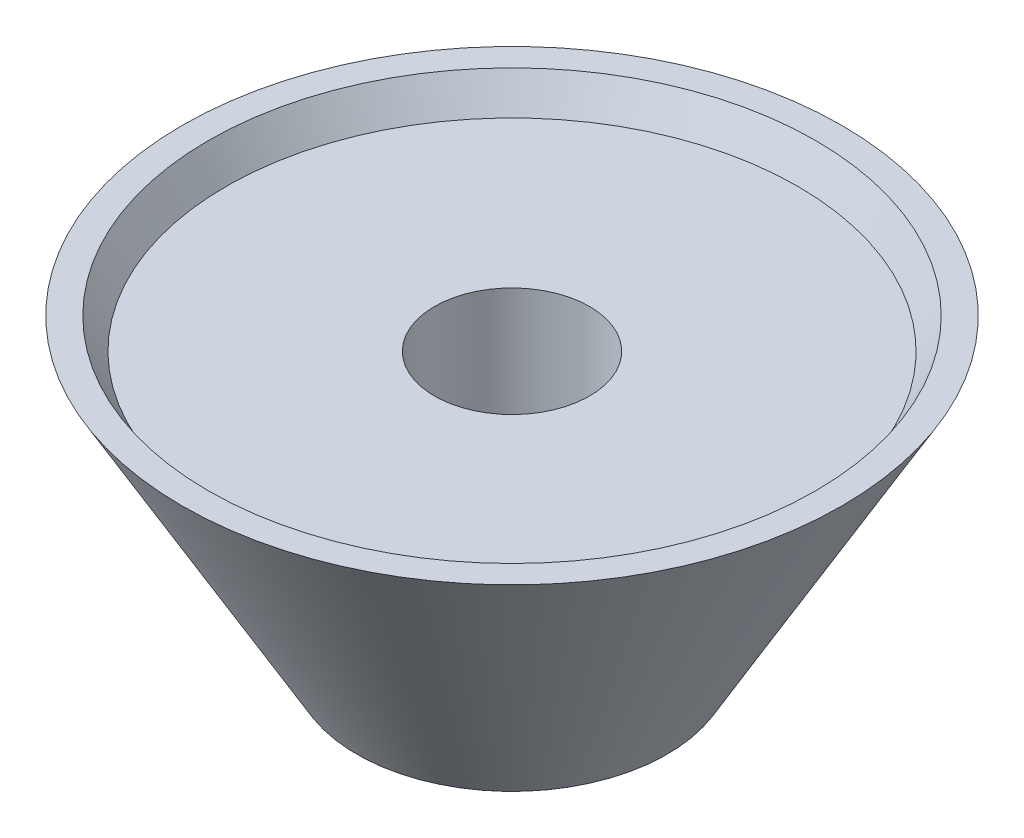
ISO-10303-21;
HEADER;
FILE_DESCRIPTION(('STEP AP214'),'2;1');
FILE_NAME('part.step','',(''),(''),'','','');
FILE_SCHEMA(('AUTOMOTIVE_DESIGN { 1 0 10303 214 1 1 1 1 }'));
ENDSEC;
DATA;
#1=APPLICATION_CONTEXT('core data for automotive mechanical design processes');
#2=APPLICATION_PROTOCOL_DEFINITION('international standard','automotive_design',2000,#1);
#3=PRODUCT_CONTEXT('',#1,'mechanical');
#4=PRODUCT('Part','Part','',(#3));
#5=PRODUCT_RELATED_PRODUCT_CATEGORY('part','',(#4));
#6=PRODUCT_DEFINITION_FORMATION('','',#4);
#7=PRODUCT_DEFINITION_CONTEXT('part definition',#1,'design');
#8=PRODUCT_DEFINITION('design','',#6,#7);
#9=PRODUCT_DEFINITION_SHAPE('','',#8);
#10=(LENGTH_UNIT() NAMED_UNIT(*) SI_UNIT(.MILLI.,.METRE.));
#11=(NAMED_UNIT(*) PLANE_ANGLE_UNIT() SI_UNIT($,.RADIAN.));
#12=(NAMED_UNIT(*) SI_UNIT($,.STERADIAN.) SOLID_ANGLE_UNIT());
#13=UNCERTAINTY_MEASURE_WITH_UNIT(LENGTH_MEASURE(1.E-05),#10,'distance_accuracy_value','');
#14=(GEOMETRIC_REPRESENTATION_CONTEXT(3) GLOBAL_UNCERTAINTY_ASSIGNED_CONTEXT((#13)) GLOBAL_UNIT_ASSIGNED_CONTEXT((#10,
#11,#12)) REPRESENTATION_CONTEXT('',''));
#15=CARTESIAN_POINT('',(0.,0.,0.));
#16=DIRECTION('',(0.,0.,1.));
#17=DIRECTION('',(1.,0.,0.));
#18=AXIS2_PLACEMENT_3D('',#15,#16,#17);
#19=CARTESIAN_POINT('',(0.,7.,0.));
#20=DIRECTION('',(0.,1.,0.));
#21=DIRECTION('',(0.,0.,1.));
#22=AXIS2_PLACEMENT_3D('',#19,#20,#21);
#23=PLANE('',#22);
#24=CARTESIAN_POINT('',(0.,7.,-4.));
#25=DIRECTION('',(0.,-1.,0.));
#26=DIRECTION('',(0.,0.,-1.));
#27=AXIS2_PLACEMENT_3D('',#24,#25,#26);
#28=CIRCLE('',#27,2.);
#29=CARTESIAN_POINT('',(0.,7.,-6.));
#30=VERTEX_POINT('',#29);
#31=EDGE_CURVE('E70',#30,#30,#28,.T.);
#32=ORIENTED_EDGE('',*,*,#31,.T.);
#33=EDGE_LOOP('',(#32));
#34=FACE_BOUND('',#33,.T.);
#35=CARTESIAN_POINT('',(0.,7.,-4.));
#36=DIRECTION('',(0.,-1.,0.));
#37=DIRECTION('',(0.,0.,-1.));
#38=AXIS2_PLACEMENT_3D('',#35,#36,#37);
#39=CIRCLE('',#38,7.36639796439536);
#40=CARTESIAN_POINT('',(0.,7.,-11.3663979643954));
#41=VERTEX_POINT('',#40);
#42=EDGE_CURVE('E55',#41,#41,#39,.T.);
#43=ORIENTED_EDGE('',*,*,#42,.F.);
#44=EDGE_LOOP('',(#43));
#45=FACE_BOUND('',#44,.T.);
#46=ADVANCED_FACE('F34',(#34,#45),#23,.T.);
#47=CARTESIAN_POINT('',(0.,7.79422863405995,-4.));
#48=DIRECTION('',(0.,1.,0.));
#49=DIRECTION('',(0.,0.,1.));
#50=AXIS2_PLACEMENT_3D('',#47,#48,#49);
#51=CONICAL_SURFACE('',#50,7.82494608006797,0.523598775598298);
#52=ORIENTED_EDGE('',*,*,#42,.T.);
#53=EDGE_LOOP('',(#52));
#54=FACE_BOUND('',#53,.T.);
#55=CARTESIAN_POINT('',(0.,7.79422863405995,-4.));
#56=DIRECTION('',(0.,-1.,0.));
#57=DIRECTION('',(0.,0.,-1.));
#58=AXIS2_PLACEMENT_3D('',#55,#56,#57);
#59=CIRCLE('',#58,7.82494608006797);
#60=CARTESIAN_POINT('',(0.,7.79422863405995,-11.824946080068));
#61=VERTEX_POINT('',#60);
#62=EDGE_CURVE('E58',#61,#61,#59,.T.);
#63=ORIENTED_EDGE('',*,*,#62,.F.);
#64=EDGE_LOOP('',(#63));
#65=FACE_BOUND('',#64,.T.);
#66=ADVANCED_FACE('F96',(#54,#65),#51,.F.);
#67=CARTESIAN_POINT('',(0.,7.79422863405995,0.));
#68=DIRECTION('',(0.,1.,0.));
#69=DIRECTION('',(0.,0.,1.));
#70=AXIS2_PLACEMENT_3D('',#67,#68,#69);
#71=PLANE('',#70);
#72=ORIENTED_EDGE('',*,*,#62,.T.);
#73=EDGE_LOOP('',(#72));
#74=FACE_BOUND('',#73,.T.);
#75=CARTESIAN_POINT('',(0.,7.79422863405995,-4.));
#76=DIRECTION('',(0.,-1.,0.));
#77=DIRECTION('',(0.,0.,-1.));
#78=AXIS2_PLACEMENT_3D('',#75,#76,#77);
#79=CIRCLE('',#78,8.5);
#80=CARTESIAN_POINT('',(0.,7.79422863405995,-12.5));
#81=VERTEX_POINT('',#80);
#82=EDGE_CURVE('E61',#81,#81,#79,.T.);
#83=ORIENTED_EDGE('',*,*,#82,.F.);
#84=EDGE_LOOP('',(#83));
#85=FACE_BOUND('',#84,.T.);
#86=ADVANCED_FACE('F90',(#74,#85),#71,.T.);
#87=CARTESIAN_POINT('',(0.,0.,-4.));
#88=DIRECTION('',(0.,1.,0.));
#89=DIRECTION('',(0.,0.,1.));
#90=AXIS2_PLACEMENT_3D('',#87,#88,#89);
#91=CONICAL_SURFACE('',#90,4.,0.523598775598299);
#92=ORIENTED_EDGE('',*,*,#82,.T.);
#93=EDGE_LOOP('',(#92));
#94=FACE_BOUND('',#93,.T.);
#95=CARTESIAN_POINT('',(0.,0.,-4.));
#96=DIRECTION('',(0.,-1.,0.));
#97=DIRECTION('',(0.,0.,-1.));
#98=AXIS2_PLACEMENT_3D('',#95,#96,#97);
#99=CIRCLE('',#98,4.);
#100=CARTESIAN_POINT('',(0.,0.,-8.));
#101=VERTEX_POINT('',#100);
#102=EDGE_CURVE('E64',#101,#101,#99,.T.);
#103=ORIENTED_EDGE('',*,*,#102,.F.);
#104=EDGE_LOOP('',(#103));
#105=FACE_BOUND('',#104,.T.);
#106=ADVANCED_FACE('F85',(#94,#105),#91,.T.);
#107=CARTESIAN_POINT('',(0.,0.,0.));
#108=DIRECTION('',(0.,1.,0.));
#109=DIRECTION('',(0.,0.,1.));
#110=AXIS2_PLACEMENT_3D('',#107,#108,#109);
#111=PLANE('',#110);
#112=CARTESIAN_POINT('',(0.,0.,-4.));
#113=DIRECTION('',(0.,-1.,0.));
#114=DIRECTION('',(0.,0.,-1.));
#115=AXIS2_PLACEMENT_3D('',#112,#113,#114);
#116=CIRCLE('',#115,2.);
#117=CARTESIAN_POINT('',(0.,0.,-6.));
#118=VERTEX_POINT('',#117);
#119=EDGE_CURVE('E67',#118,#118,#116,.T.);
#120=ORIENTED_EDGE('',*,*,#119,.F.);
#121=EDGE_LOOP('',(#120));
#122=FACE_BOUND('',#121,.T.);
#123=ORIENTED_EDGE('',*,*,#102,.T.);
#124=EDGE_LOOP('',(#123));
#125=FACE_BOUND('',#124,.T.);
#126=ADVANCED_FACE('F79',(#122,#125),#111,.F.);
#127=CARTESIAN_POINT('',(0.,0.,-4.));
#128=DIRECTION('',(0.,-1.,0.));
#129=DIRECTION('',(0.,0.,-1.));
#130=AXIS2_PLACEMENT_3D('',#127,#128,#129);
#131=CYLINDRICAL_SURFACE('',#130,2.);
#132=ORIENTED_EDGE('',*,*,#31,.F.);
#133=EDGE_LOOP('',(#132));
#134=FACE_BOUND('',#133,.T.);
#135=ORIENTED_EDGE('',*,*,#119,.T.);
#136=EDGE_LOOP('',(#135));
#137=FACE_BOUND('',#136,.T.);
#138=ADVANCED_FACE('F76',(#134,#137),#131,.F.);
#139=CLOSED_SHELL('',(#46,#66,#86,#106,#126,#138));
#140=CARTESIAN_POINT('',(0.,0.,-4.));
#141=DIRECTION('',(0.,-1.,0.));
#142=DIRECTION('',(0.,0.,-1.));
#143=AXIS2_PLACEMENT_3D('',#140,#141,#142);
#144=CYLINDRICAL_SURFACE('',#143,3.);
#145=CARTESIAN_POINT('',(0.,1.4,-4.));
#146=DIRECTION('',(0.,-1.,0.));
#147=DIRECTION('',(0.,0.,-1.));
#148=AXIS2_PLACEMENT_3D('',#145,#146,#147);
#149=CIRCLE('',#148,3.);
#150=CARTESIAN_POINT('',(0.,1.4,-7.));
#151=VERTEX_POINT('',#150);
#152=EDGE_CURVE('E10',#151,#151,#149,.T.);
#153=ORIENTED_EDGE('',*,*,#152,.F.);
#154=EDGE_LOOP('',(#153));
#155=FACE_BOUND('',#154,.T.);
#156=CARTESIAN_POINT('',(0.,6.4,-4.));
#157=DIRECTION('',(0.,-1.,0.));
#158=DIRECTION('',(0.,0.,-1.));
#159=AXIS2_PLACEMENT_3D('',#156,#157,#158);
#160=CIRCLE('',#159,3.);
#161=CARTESIAN_POINT('',(0.,6.4,-7.));
#162=VERTEX_POINT('',#161);
#163=EDGE_CURVE('E50',#162,#162,#160,.T.);
#164=ORIENTED_EDGE('',*,*,#163,.T.);
#165=EDGE_LOOP('',(#164));
#166=FACE_BOUND('',#165,.T.);
#167=ADVANCED_FACE('F36',(#155,#166),#144,.T.);
#168=CARTESIAN_POINT('',(0.,1.4,0.));
#169=DIRECTION('',(0.,-1.,0.));
#170=DIRECTION('',(0.,0.,-1.));
#171=AXIS2_PLACEMENT_3D('',#168,#169,#170);
#172=PLANE('',#171);
#173=CARTESIAN_POINT('',(0.,1.4,-4.));
#174=DIRECTION('',(0.,-1.,0.));
#175=DIRECTION('',(0.,0.,-1.));
#176=AXIS2_PLACEMENT_3D('',#173,#174,#175);
#177=CIRCLE('',#176,4.);
#178=CARTESIAN_POINT('',(0.,1.4,-8.));
#179=VERTEX_POINT('',#178);
#180=EDGE_CURVE('E42',#179,#179,#177,.T.);
#181=ORIENTED_EDGE('',*,*,#180,.F.);
#182=EDGE_LOOP('',(#181));
#183=FACE_BOUND('',#182,.T.);
#184=ORIENTED_EDGE('',*,*,#152,.T.);
#185=EDGE_LOOP('',(#184));
#186=FACE_BOUND('',#185,.T.);
#187=ADVANCED_FACE('F114',(#183,#186),#172,.F.);
#188=CARTESIAN_POINT('',(0.,1.4,-4.));
#189=DIRECTION('',(0.,1.,0.));
#190=DIRECTION('',(0.,0.,1.));
#191=AXIS2_PLACEMENT_3D('',#188,#189,#190);
#192=CONICAL_SURFACE('',#191,4.,0.523598775598299);
#193=CARTESIAN_POINT('',(0.,6.4,-4.));
#194=DIRECTION('',(0.,-1.,0.));
#195=DIRECTION('',(0.,0.,-1.));
#196=AXIS2_PLACEMENT_3D('',#193,#194,#195);
#197=CIRCLE('',#196,6.88675134594813);
#198=CARTESIAN_POINT('',(0.,6.4,-10.8867513459481));
#199=VERTEX_POINT('',#198);
#200=EDGE_CURVE('E46',#199,#199,#197,.T.);
#201=ORIENTED_EDGE('',*,*,#200,.F.);
#202=EDGE_LOOP('',(#201));
#203=FACE_BOUND('',#202,.T.);
#204=ORIENTED_EDGE('',*,*,#180,.T.);
#205=EDGE_LOOP('',(#204));
#206=FACE_BOUND('',#205,.T.);
#207=ADVANCED_FACE('F110',(#203,#206),#192,.F.);
#208=CARTESIAN_POINT('',(0.,6.4,0.));
#209=DIRECTION('',(0.,1.,0.));
#210=DIRECTION('',(0.,0.,1.));
#211=AXIS2_PLACEMENT_3D('',#208,#209,#210);
#212=PLANE('',#211);
#213=ORIENTED_EDGE('',*,*,#163,.F.);
#214=EDGE_LOOP('',(#213));
#215=FACE_BOUND('',#214,.T.);
#216=ORIENTED_EDGE('',*,*,#200,.T.);
#217=EDGE_LOOP('',(#216));
#218=FACE_BOUND('',#217,.T.);
#219=ADVANCED_FACE('F107',(#215,#218),#212,.F.);
#220=CLOSED_SHELL('',(#167,#187,#207,#219));
#221=ORIENTED_CLOSED_SHELL('',*,#220,.T.);
#222=BREP_WITH_VOIDS('B2',#139,(#221));
#223=ADVANCED_BREP_SHAPE_REPRESENTATION('',(#18,#222),#14);
#224=SHAPE_DEFINITION_REPRESENTATION(#9,#223);
ENDSEC;
END-ISO-10303-21;
